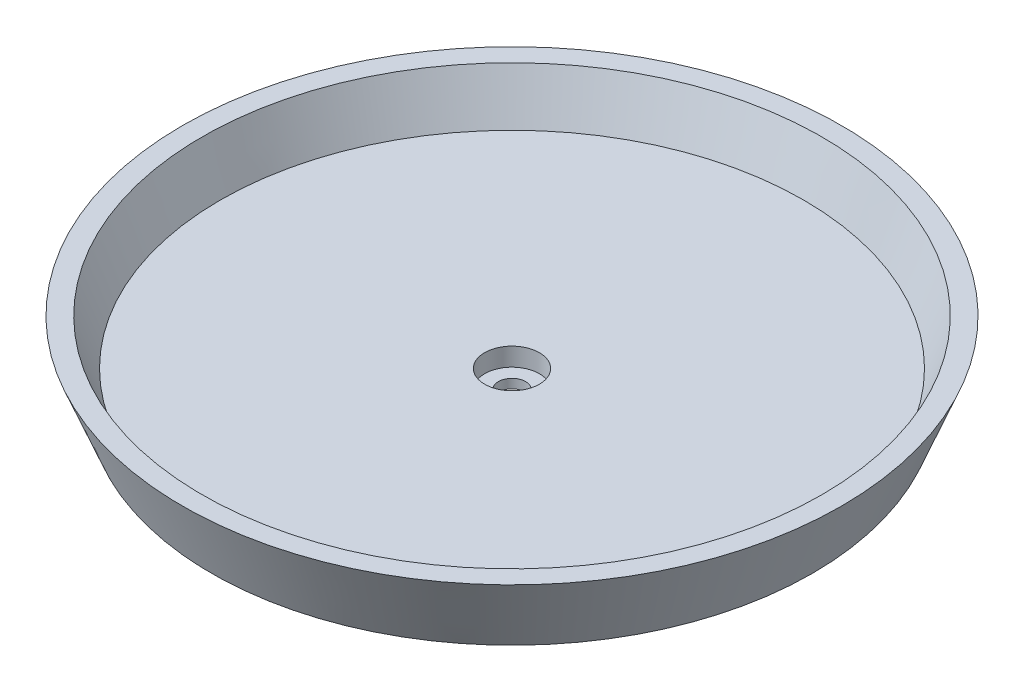
ISO-10303-21;
HEADER;
FILE_DESCRIPTION(('STEP AP214'),'2;1');
FILE_NAME('part.step','',(''),(''),'','','');
FILE_SCHEMA(('AUTOMOTIVE_DESIGN { 1 0 10303 214 1 1 1 1 }'));
ENDSEC;
DATA;
#1=APPLICATION_CONTEXT('core data for automotive mechanical design processes');
#2=APPLICATION_PROTOCOL_DEFINITION('international standard','automotive_design',2000,#1);
#3=PRODUCT_CONTEXT('',#1,'mechanical');
#4=PRODUCT('Part','Part','',(#3));
#5=PRODUCT_RELATED_PRODUCT_CATEGORY('part','',(#4));
#6=PRODUCT_DEFINITION_FORMATION('','',#4);
#7=PRODUCT_DEFINITION_CONTEXT('part definition',#1,'design');
#8=PRODUCT_DEFINITION('design','',#6,#7);
#9=PRODUCT_DEFINITION_SHAPE('','',#8);
#10=(LENGTH_UNIT() NAMED_UNIT(*) SI_UNIT(.MILLI.,.METRE.));
#11=(NAMED_UNIT(*) PLANE_ANGLE_UNIT() SI_UNIT($,.RADIAN.));
#12=(NAMED_UNIT(*) SI_UNIT($,.STERADIAN.) SOLID_ANGLE_UNIT());
#13=UNCERTAINTY_MEASURE_WITH_UNIT(LENGTH_MEASURE(1.E-05),#10,'distance_accuracy_value','');
#14=(GEOMETRIC_REPRESENTATION_CONTEXT(3) GLOBAL_UNCERTAINTY_ASSIGNED_CONTEXT((#13)) GLOBAL_UNIT_ASSIGNED_CONTEXT((#10,
#11,#12)) REPRESENTATION_CONTEXT('',''));
#15=CARTESIAN_POINT('',(0.,0.,0.));
#16=DIRECTION('',(0.,0.,1.));
#17=DIRECTION('',(1.,0.,0.));
#18=AXIS2_PLACEMENT_3D('',#15,#16,#17);
#19=CARTESIAN_POINT('',(-16.5773971627522,13.4761695896848,0.));
#20=DIRECTION('',(0.,1.,0.));
#21=DIRECTION('',(-1.,0.,0.));
#22=AXIS2_PLACEMENT_3D('',#19,#20,#21);
#23=CONICAL_SURFACE('',#22,36.1540659228538,0.380506377112368);
#24=CARTESIAN_POINT('',(-16.5773971627522,5.47616958968478,0.));
#25=DIRECTION('',(0.,-1.,0.));
#26=DIRECTION('',(1.,0.,0.));
#27=AXIS2_PLACEMENT_3D('',#24,#25,#26);
#28=CIRCLE('',#27,32.9540659228538);
#29=CARTESIAN_POINT('',(16.3766687601016,5.47616958968477,0.));
#30=VERTEX_POINT('',#29);
#31=EDGE_CURVE('E10',#30,#30,#28,.T.);
#32=ORIENTED_EDGE('',*,*,#31,.F.);
#33=EDGE_LOOP('',(#32));
#34=FACE_BOUND('',#33,.T.);
#35=CARTESIAN_POINT('',(-16.5773971627522,13.4761695896848,0.));
#36=DIRECTION('',(0.,-1.,0.));
#37=DIRECTION('',(1.,0.,0.));
#38=AXIS2_PLACEMENT_3D('',#35,#36,#37);
#39=CIRCLE('',#38,36.1540659228538);
#40=CARTESIAN_POINT('',(19.5766687601016,13.4761695896848,0.));
#41=VERTEX_POINT('',#40);
#42=EDGE_CURVE('E66',#41,#41,#39,.T.);
#43=ORIENTED_EDGE('',*,*,#42,.T.);
#44=EDGE_LOOP('',(#43));
#45=FACE_BOUND('',#44,.T.);
#46=ADVANCED_FACE('F41',(#34,#45),#23,.T.);
#47=CARTESIAN_POINT('',(0.,5.47616958968478,0.));
#48=DIRECTION('',(0.,-1.,0.));
#49=DIRECTION('',(1.,0.,0.));
#50=AXIS2_PLACEMENT_3D('',#47,#48,#49);
#51=PLANE('',#50);
#52=ORIENTED_EDGE('',*,*,#31,.T.);
#53=EDGE_LOOP('',(#52));
#54=FACE_BOUND('',#53,.T.);
#55=CARTESIAN_POINT('',(-16.5773971627522,5.4761695896848,0.));
#56=DIRECTION('',(0.,-1.,0.));
#57=DIRECTION('',(1.,0.,0.));
#58=AXIS2_PLACEMENT_3D('',#55,#56,#57);
#59=CIRCLE('',#58,1.5);
#60=CARTESIAN_POINT('',(-15.0773971627522,5.4761695896848,0.));
#61=VERTEX_POINT('',#60);
#62=EDGE_CURVE('E50',#61,#61,#59,.T.);
#63=ORIENTED_EDGE('',*,*,#62,.F.);
#64=EDGE_LOOP('',(#63));
#65=FACE_BOUND('',#64,.T.);
#66=ADVANCED_FACE('F95',(#54,#65),#51,.T.);
#67=CARTESIAN_POINT('',(-16.5773971627522,5.4761695896848,0.));
#68=DIRECTION('',(0.,-1.,0.));
#69=DIRECTION('',(1.,0.,0.));
#70=AXIS2_PLACEMENT_3D('',#67,#68,#69);
#71=CYLINDRICAL_SURFACE('',#70,1.5);
#72=CARTESIAN_POINT('',(-16.5773971627522,6.4761695896848,0.));
#73=DIRECTION('',(0.,-1.,0.));
#74=DIRECTION('',(1.,0.,0.));
#75=AXIS2_PLACEMENT_3D('',#72,#73,#74);
#76=CIRCLE('',#75,1.5);
#77=CARTESIAN_POINT('',(-15.0773971627522,6.47616958968479,0.));
#78=VERTEX_POINT('',#77);
#79=EDGE_CURVE('E51',#78,#78,#76,.T.);
#80=ORIENTED_EDGE('',*,*,#79,.F.);
#81=EDGE_LOOP('',(#80));
#82=FACE_BOUND('',#81,.T.);
#83=ORIENTED_EDGE('',*,*,#62,.T.);
#84=EDGE_LOOP('',(#83));
#85=FACE_BOUND('',#84,.T.);
#86=ADVANCED_FACE('F100',(#82,#85),#71,.F.);
#87=CARTESIAN_POINT('',(0.,6.47616958968479,0.));
#88=DIRECTION('',(0.,-1.,0.));
#89=DIRECTION('',(1.,0.,0.));
#90=AXIS2_PLACEMENT_3D('',#87,#88,#89);
#91=PLANE('',#90);
#92=CARTESIAN_POINT('',(-16.5773971627522,6.47616958968479,0.));
#93=DIRECTION('',(0.,-1.,0.));
#94=DIRECTION('',(1.,0.,0.));
#95=AXIS2_PLACEMENT_3D('',#92,#93,#94);
#96=CIRCLE('',#95,3.00000000000001);
#97=CARTESIAN_POINT('',(-13.5773971627522,6.47616958968479,0.));
#98=VERTEX_POINT('',#97);
#99=EDGE_CURVE('E54',#98,#98,#96,.T.);
#100=ORIENTED_EDGE('',*,*,#99,.F.);
#101=EDGE_LOOP('',(#100));
#102=FACE_BOUND('',#101,.T.);
#103=ORIENTED_EDGE('',*,*,#79,.T.);
#104=EDGE_LOOP('',(#103));
#105=FACE_BOUND('',#104,.T.);
#106=ADVANCED_FACE('F101',(#102,#105),#91,.F.);
#107=CARTESIAN_POINT('',(-16.5773971627522,5.4761695896848,0.));
#108=DIRECTION('',(0.,-1.,0.));
#109=DIRECTION('',(1.,0.,0.));
#110=AXIS2_PLACEMENT_3D('',#107,#108,#109);
#111=CYLINDRICAL_SURFACE('',#110,3.00000000000001);
#112=ORIENTED_EDGE('',*,*,#99,.T.);
#113=EDGE_LOOP('',(#112));
#114=FACE_BOUND('',#113,.T.);
#115=CARTESIAN_POINT('',(-16.5773971627522,8.47616958968479,0.));
#116=DIRECTION('',(0.,-1.,0.));
#117=DIRECTION('',(1.,0.,0.));
#118=AXIS2_PLACEMENT_3D('',#115,#116,#117);
#119=CIRCLE('',#118,3.00000000000001);
#120=CARTESIAN_POINT('',(-13.5773971627522,8.47616958968479,0.));
#121=VERTEX_POINT('',#120);
#122=EDGE_CURVE('E58',#121,#121,#119,.T.);
#123=ORIENTED_EDGE('',*,*,#122,.F.);
#124=EDGE_LOOP('',(#123));
#125=FACE_BOUND('',#124,.T.);
#126=ADVANCED_FACE('F86',(#114,#125),#111,.F.);
#127=CARTESIAN_POINT('',(0.,8.47616958968477,0.));
#128=DIRECTION('',(0.,1.,0.));
#129=DIRECTION('',(-1.,0.,0.));
#130=AXIS2_PLACEMENT_3D('',#127,#128,#129);
#131=PLANE('',#130);
#132=ORIENTED_EDGE('',*,*,#122,.T.);
#133=EDGE_LOOP('',(#132));
#134=FACE_BOUND('',#133,.T.);
#135=CARTESIAN_POINT('',(-16.5773971627522,8.47616958968477,0.));
#136=DIRECTION('',(0.,-1.,0.));
#137=DIRECTION('',(1.,0.,0.));
#138=AXIS2_PLACEMENT_3D('',#135,#136,#137);
#139=CIRCLE('',#138,32.);
#140=CARTESIAN_POINT('',(15.4226028372478,8.47616958968476,0.));
#141=VERTEX_POINT('',#140);
#142=EDGE_CURVE('E65',#141,#141,#139,.T.);
#143=ORIENTED_EDGE('',*,*,#142,.F.);
#144=EDGE_LOOP('',(#143));
#145=FACE_BOUND('',#144,.T.);
#146=ADVANCED_FACE('F85',(#134,#145),#131,.T.);
#147=CARTESIAN_POINT('',(-16.5773971627522,13.4761695896848,0.));
#148=DIRECTION('',(0.,1.,0.));
#149=DIRECTION('',(-1.,0.,0.));
#150=AXIS2_PLACEMENT_3D('',#147,#148,#149);
#151=CONICAL_SURFACE('',#150,34.,0.380506377112366);
#152=ORIENTED_EDGE('',*,*,#142,.T.);
#153=EDGE_LOOP('',(#152));
#154=FACE_BOUND('',#153,.T.);
#155=CARTESIAN_POINT('',(-16.5773971627522,13.4761695896848,0.));
#156=DIRECTION('',(0.,-1.,0.));
#157=DIRECTION('',(1.,0.,0.));
#158=AXIS2_PLACEMENT_3D('',#155,#156,#157);
#159=CIRCLE('',#158,34.);
#160=CARTESIAN_POINT('',(17.4226028372478,13.4761695896848,0.));
#161=VERTEX_POINT('',#160);
#162=EDGE_CURVE('E67',#161,#161,#159,.T.);
#163=ORIENTED_EDGE('',*,*,#162,.F.);
#164=EDGE_LOOP('',(#163));
#165=FACE_BOUND('',#164,.T.);
#166=ADVANCED_FACE('F76',(#154,#165),#151,.F.);
#167=CARTESIAN_POINT('',(0.,13.4761695896848,0.));
#168=DIRECTION('',(0.,-1.,0.));
#169=DIRECTION('',(1.,0.,0.));
#170=AXIS2_PLACEMENT_3D('',#167,#168,#169);
#171=PLANE('',#170);
#172=ORIENTED_EDGE('',*,*,#42,.F.);
#173=EDGE_LOOP('',(#172));
#174=FACE_BOUND('',#173,.T.);
#175=ORIENTED_EDGE('',*,*,#162,.T.);
#176=EDGE_LOOP('',(#175));
#177=FACE_BOUND('',#176,.T.);
#178=ADVANCED_FACE('F74',(#174,#177),#171,.F.);
#179=CLOSED_SHELL('',(#46,#66,#86,#106,#126,#146,#166,#178));
#180=MANIFOLD_SOLID_BREP('B2',#179);
#181=ADVANCED_BREP_SHAPE_REPRESENTATION('',(#18,#180),#14);
#182=SHAPE_DEFINITION_REPRESENTATION(#9,#181);
ENDSEC;
END-ISO-10303-21;
